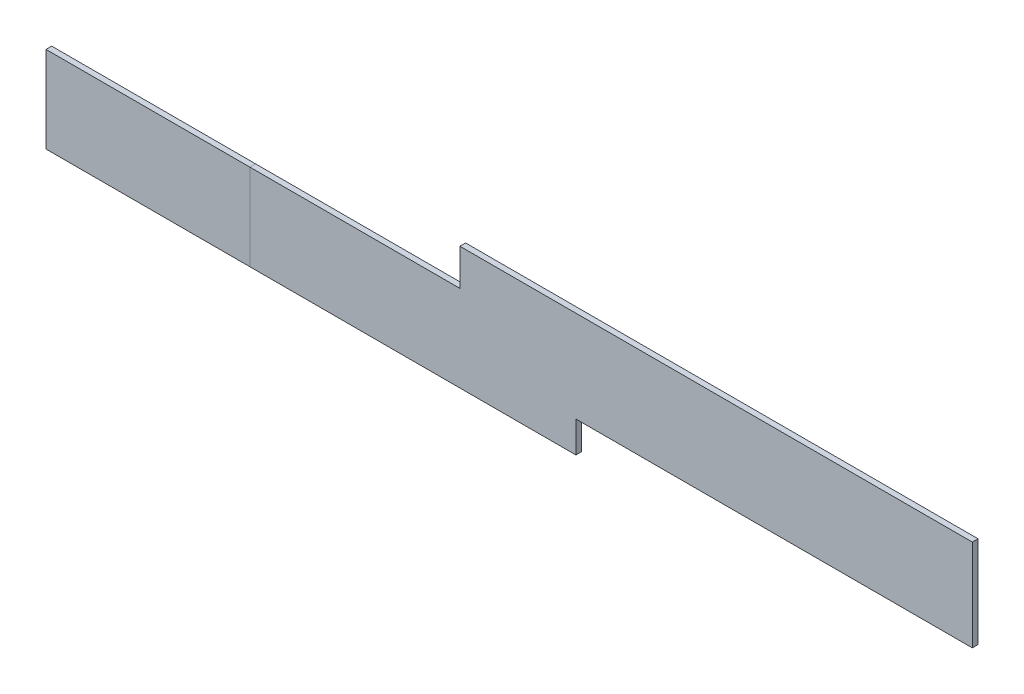
ISO-10303-21;
HEADER;
FILE_DESCRIPTION(('STEP AP214'),'2;1');
FILE_NAME('part.step','',(''),(''),'','','');
FILE_SCHEMA(('AUTOMOTIVE_DESIGN { 1 0 10303 214 1 1 1 1 }'));
ENDSEC;
DATA;
#1=APPLICATION_CONTEXT('core data for automotive mechanical design processes');
#2=APPLICATION_PROTOCOL_DEFINITION('international standard','automotive_design',2000,#1);
#3=PRODUCT_CONTEXT('',#1,'mechanical');
#4=PRODUCT('Part','Part','',(#3));
#5=PRODUCT_RELATED_PRODUCT_CATEGORY('part','',(#4));
#6=PRODUCT_DEFINITION_FORMATION('','',#4);
#7=PRODUCT_DEFINITION_CONTEXT('part definition',#1,'design');
#8=PRODUCT_DEFINITION('design','',#6,#7);
#9=PRODUCT_DEFINITION_SHAPE('','',#8);
#10=(LENGTH_UNIT() NAMED_UNIT(*) SI_UNIT(.MILLI.,.METRE.));
#11=(NAMED_UNIT(*) PLANE_ANGLE_UNIT() SI_UNIT($,.RADIAN.));
#12=(NAMED_UNIT(*) SI_UNIT($,.STERADIAN.) SOLID_ANGLE_UNIT());
#13=UNCERTAINTY_MEASURE_WITH_UNIT(LENGTH_MEASURE(1.E-05),#10,'distance_accuracy_value','');
#14=(GEOMETRIC_REPRESENTATION_CONTEXT(3) GLOBAL_UNCERTAINTY_ASSIGNED_CONTEXT((#13)) GLOBAL_UNIT_ASSIGNED_CONTEXT((#10,
#11,#12)) REPRESENTATION_CONTEXT('',''));
#15=CARTESIAN_POINT('',(0.,0.,0.));
#16=DIRECTION('',(0.,0.,1.));
#17=DIRECTION('',(1.,0.,0.));
#18=AXIS2_PLACEMENT_3D('',#15,#16,#17);
#19=CARTESIAN_POINT('',(0.,48.0314,-126.454734060226));
#20=DIRECTION('',(1.,0.,0.));
#21=DIRECTION('',(0.,1.,0.));
#22=AXIS2_PLACEMENT_3D('',#19,#20,#21);
#23=PLANE('',#22);
#24=DIRECTION('',(0.,-1.,0.));
#25=VECTOR('',#24,1.);
#26=CARTESIAN_POINT('',(0.,48.0314,-3.175));
#27=LINE('',#26,#25);
#28=CARTESIAN_POINT('',(0.,48.0314,-3.175));
#29=VERTEX_POINT('',#28);
#30=CARTESIAN_POINT('',(0.,0.,-3.175));
#31=VERTEX_POINT('',#30);
#32=EDGE_CURVE('E51',#29,#31,#27,.T.);
#33=ORIENTED_EDGE('',*,*,#32,.F.);
#34=DIRECTION('',(0.,0.,1.));
#35=VECTOR('',#34,1.);
#36=CARTESIAN_POINT('',(0.,48.0314,-126.454734060226));
#37=LINE('',#36,#35);
#38=CARTESIAN_POINT('',(0.,48.0314,0.));
#39=VERTEX_POINT('',#38);
#40=EDGE_CURVE('E79',#29,#39,#37,.T.);
#41=ORIENTED_EDGE('',*,*,#40,.T.);
#42=DIRECTION('',(0.,1.,0.));
#43=VECTOR('',#42,1.);
#44=CARTESIAN_POINT('',(0.,48.0314,0.));
#45=LINE('',#44,#43);
#46=CARTESIAN_POINT('',(0.,0.,0.));
#47=VERTEX_POINT('',#46);
#48=EDGE_CURVE('E83',#47,#39,#45,.T.);
#49=ORIENTED_EDGE('',*,*,#48,.F.);
#50=DIRECTION('',(0.,0.,1.));
#51=VECTOR('',#50,1.);
#52=CARTESIAN_POINT('',(0.,0.,-126.454734060226));
#53=LINE('',#52,#51);
#54=EDGE_CURVE('E106',#31,#47,#53,.T.);
#55=ORIENTED_EDGE('',*,*,#54,.F.);
#56=EDGE_LOOP('',(#33,#41,#49,#55));
#57=FACE_BOUND('',#56,.T.);
#58=ADVANCED_FACE('F43',(#57),#23,.T.);
#59=CARTESIAN_POINT('',(0.,0.,-126.454734060226));
#60=DIRECTION('',(0.,-1.,0.));
#61=DIRECTION('',(1.,0.,0.));
#62=AXIS2_PLACEMENT_3D('',#59,#60,#61);
#63=PLANE('',#62);
#64=DIRECTION('',(-1.,0.,0.));
#65=VECTOR('',#64,1.);
#66=CARTESIAN_POINT('',(0.,0.,-3.175));
#67=LINE('',#66,#65);
#68=CARTESIAN_POINT('',(-113.538,0.,-3.175));
#69=VERTEX_POINT('',#68);
#70=EDGE_CURVE('E57',#31,#69,#67,.T.);
#71=ORIENTED_EDGE('',*,*,#70,.F.);
#72=ORIENTED_EDGE('',*,*,#54,.T.);
#73=DIRECTION('',(1.,0.,0.));
#74=VECTOR('',#73,1.);
#75=CARTESIAN_POINT('',(0.,0.,0.));
#76=LINE('',#75,#74);
#77=CARTESIAN_POINT('',(-113.538,0.,0.));
#78=VERTEX_POINT('',#77);
#79=EDGE_CURVE('E88',#78,#47,#76,.T.);
#80=ORIENTED_EDGE('',*,*,#79,.F.);
#81=DIRECTION('',(0.,0.,1.));
#82=VECTOR('',#81,1.);
#83=CARTESIAN_POINT('',(-113.538,0.,-126.454734060226));
#84=LINE('',#83,#82);
#85=EDGE_CURVE('E109',#69,#78,#84,.T.);
#86=ORIENTED_EDGE('',*,*,#85,.F.);
#87=EDGE_LOOP('',(#71,#72,#80,#86));
#88=FACE_BOUND('',#87,.T.);
#89=ADVANCED_FACE('F115',(#88),#63,.T.);
#90=CARTESIAN_POINT('',(-113.538,48.0314,-126.454734060226));
#91=DIRECTION('',(-1.,0.,0.));
#92=DIRECTION('',(0.,0.,1.));
#93=AXIS2_PLACEMENT_3D('',#90,#91,#92);
#94=PLANE('',#93);
#95=DIRECTION('',(0.,1.,0.));
#96=VECTOR('',#95,1.);
#97=CARTESIAN_POINT('',(-113.538,48.0314,-3.175));
#98=LINE('',#97,#96);
#99=CARTESIAN_POINT('',(-113.538,48.0314,-3.175));
#100=VERTEX_POINT('',#99);
#101=EDGE_CURVE('E108',#69,#100,#98,.T.);
#102=ORIENTED_EDGE('',*,*,#101,.F.);
#103=ORIENTED_EDGE('',*,*,#85,.T.);
#104=DIRECTION('',(0.,-1.,0.));
#105=VECTOR('',#104,1.);
#106=CARTESIAN_POINT('',(-113.538,48.0314,0.));
#107=LINE('',#106,#105);
#108=CARTESIAN_POINT('',(-113.538,48.0314,0.));
#109=VERTEX_POINT('',#108);
#110=EDGE_CURVE('E96',#109,#78,#107,.T.);
#111=ORIENTED_EDGE('',*,*,#110,.F.);
#112=DIRECTION('',(0.,0.,1.));
#113=VECTOR('',#112,1.);
#114=CARTESIAN_POINT('',(-113.538,48.0314,-126.454734060226));
#115=LINE('',#114,#113);
#116=EDGE_CURVE('E87',#100,#109,#115,.T.);
#117=ORIENTED_EDGE('',*,*,#116,.F.);
#118=EDGE_LOOP('',(#102,#103,#111,#117));
#119=FACE_BOUND('',#118,.T.);
#120=ADVANCED_FACE('F113',(#119),#94,.T.);
#121=CARTESIAN_POINT('',(0.,48.0314,-126.454734060226));
#122=DIRECTION('',(0.,1.,0.));
#123=DIRECTION('',(0.,0.,1.));
#124=AXIS2_PLACEMENT_3D('',#121,#122,#123);
#125=PLANE('',#124);
#126=DIRECTION('',(1.,0.,0.));
#127=VECTOR('',#126,1.);
#128=CARTESIAN_POINT('',(0.,48.0314,-3.175));
#129=LINE('',#128,#127);
#130=EDGE_CURVE('E12',#100,#29,#129,.T.);
#131=ORIENTED_EDGE('',*,*,#130,.F.);
#132=ORIENTED_EDGE('',*,*,#116,.T.);
#133=DIRECTION('',(-1.,0.,0.));
#134=VECTOR('',#133,1.);
#135=CARTESIAN_POINT('',(0.,48.0314,0.));
#136=LINE('',#135,#134);
#137=EDGE_CURVE('E90',#39,#109,#136,.T.);
#138=ORIENTED_EDGE('',*,*,#137,.F.);
#139=ORIENTED_EDGE('',*,*,#40,.F.);
#140=EDGE_LOOP('',(#131,#132,#138,#139));
#141=FACE_BOUND('',#140,.T.);
#142=ADVANCED_FACE('F91',(#141),#125,.T.);
#143=CARTESIAN_POINT('',(0.,0.,0.));
#144=DIRECTION('',(0.,0.,-1.));
#145=DIRECTION('',(-1.,0.,0.));
#146=AXIS2_PLACEMENT_3D('',#143,#144,#145);
#147=PLANE('',#146);
#148=ORIENTED_EDGE('',*,*,#48,.T.);
#149=ORIENTED_EDGE('',*,*,#137,.T.);
#150=ORIENTED_EDGE('',*,*,#110,.T.);
#151=ORIENTED_EDGE('',*,*,#79,.T.);
#152=EDGE_LOOP('',(#148,#149,#150,#151));
#153=FACE_BOUND('',#152,.T.);
#154=ADVANCED_FACE('F98',(#153),#147,.F.);
#155=CARTESIAN_POINT('',(0.,0.,-3.175));
#156=DIRECTION('',(0.,0.,1.));
#157=DIRECTION('',(1.,0.,0.));
#158=AXIS2_PLACEMENT_3D('',#155,#156,#157);
#159=PLANE('',#158);
#160=ORIENTED_EDGE('',*,*,#32,.T.);
#161=ORIENTED_EDGE('',*,*,#70,.T.);
#162=ORIENTED_EDGE('',*,*,#101,.T.);
#163=ORIENTED_EDGE('',*,*,#130,.T.);
#164=EDGE_LOOP('',(#160,#161,#162,#163));
#165=FACE_BOUND('',#164,.T.);
#166=ADVANCED_FACE('F117',(#165),#159,.F.);
#167=CLOSED_SHELL('',(#58,#89,#120,#142,#154,#166));
#168=MANIFOLD_SOLID_BREP('B2',#167);
#169=CARTESIAN_POINT('',(0.,0.,-3.175));
#170=DIRECTION('',(0.,-1.,0.));
#171=DIRECTION('',(0.,0.,-1.));
#172=AXIS2_PLACEMENT_3D('',#169,#170,#171);
#173=PLANE('',#172);
#174=DIRECTION('',(1.,0.,0.));
#175=VECTOR('',#174,1.);
#176=CARTESIAN_POINT('',(0.,0.,0.));
#177=LINE('',#176,#175);
#178=CARTESIAN_POINT('',(0.,0.,0.));
#179=VERTEX_POINT('',#178);
#180=CARTESIAN_POINT('',(181.39918,0.,0.));
#181=VERTEX_POINT('',#180);
#182=EDGE_CURVE('E273',#179,#181,#177,.T.);
#183=ORIENTED_EDGE('',*,*,#182,.F.);
#184=DIRECTION('',(0.,0.,1.));
#185=VECTOR('',#184,1.);
#186=CARTESIAN_POINT('',(0.,0.,-3.175));
#187=LINE('',#186,#185);
#188=CARTESIAN_POINT('',(0.,0.,-3.175));
#189=VERTEX_POINT('',#188);
#190=EDGE_CURVE('E41',#189,#179,#187,.T.);
#191=ORIENTED_EDGE('',*,*,#190,.F.);
#192=DIRECTION('',(1.,0.,0.));
#193=VECTOR('',#192,1.);
#194=CARTESIAN_POINT('',(0.,0.,-3.175));
#195=LINE('',#194,#193);
#196=CARTESIAN_POINT('',(181.39918,0.,-3.17500000000001));
#197=VERTEX_POINT('',#196);
#198=EDGE_CURVE('E278',#189,#197,#195,.T.);
#199=ORIENTED_EDGE('',*,*,#198,.T.);
#200=DIRECTION('',(0.,0.,1.));
#201=VECTOR('',#200,1.);
#202=CARTESIAN_POINT('',(181.39918,0.,-146.015451823004));
#203=LINE('',#202,#201);
#204=EDGE_CURVE('E249',#197,#181,#203,.T.);
#205=ORIENTED_EDGE('',*,*,#204,.T.);
#206=EDGE_LOOP('',(#183,#191,#199,#205));
#207=FACE_BOUND('',#206,.T.);
#208=ADVANCED_FACE('F167',(#207),#173,.T.);
#209=CARTESIAN_POINT('',(0.,48.0314,-3.175));
#210=DIRECTION('',(-1.,0.,0.));
#211=DIRECTION('',(0.,-1.,0.));
#212=AXIS2_PLACEMENT_3D('',#209,#210,#211);
#213=PLANE('',#212);
#214=DIRECTION('',(0.,-1.,0.));
#215=VECTOR('',#214,1.);
#216=CARTESIAN_POINT('',(0.,48.0314,0.));
#217=LINE('',#216,#215);
#218=CARTESIAN_POINT('',(0.,48.0314,0.));
#219=VERTEX_POINT('',#218);
#220=EDGE_CURVE('E281',#219,#179,#217,.T.);
#221=ORIENTED_EDGE('',*,*,#220,.F.);
#222=DIRECTION('',(0.,0.,1.));
#223=VECTOR('',#222,1.);
#224=CARTESIAN_POINT('',(0.,48.0314,-3.175));
#225=LINE('',#224,#223);
#226=CARTESIAN_POINT('',(0.,48.0314,-3.175));
#227=VERTEX_POINT('',#226);
#228=EDGE_CURVE('E176',#227,#219,#225,.T.);
#229=ORIENTED_EDGE('',*,*,#228,.F.);
#230=DIRECTION('',(0.,-1.,0.));
#231=VECTOR('',#230,1.);
#232=CARTESIAN_POINT('',(0.,48.0314,-3.175));
#233=LINE('',#232,#231);
#234=EDGE_CURVE('E288',#227,#189,#233,.T.);
#235=ORIENTED_EDGE('',*,*,#234,.T.);
#236=ORIENTED_EDGE('',*,*,#190,.T.);
#237=EDGE_LOOP('',(#221,#229,#235,#236));
#238=FACE_BOUND('',#237,.T.);
#239=ADVANCED_FACE('F304',(#238),#213,.T.);
#240=CARTESIAN_POINT('',(0.,48.0314,-3.175));
#241=DIRECTION('',(0.,1.,0.));
#242=DIRECTION('',(0.,0.,1.));
#243=AXIS2_PLACEMENT_3D('',#240,#241,#242);
#244=PLANE('',#243);
#245=DIRECTION('',(-1.,0.,0.));
#246=VECTOR('',#245,1.);
#247=CARTESIAN_POINT('',(0.,48.0314,0.));
#248=LINE('',#247,#246);
#249=CARTESIAN_POINT('',(116.84,48.0314,0.));
#250=VERTEX_POINT('',#249);
#251=EDGE_CURVE('E296',#250,#219,#248,.T.);
#252=ORIENTED_EDGE('',*,*,#251,.F.);
#253=DIRECTION('',(0.,0.,1.));
#254=VECTOR('',#253,1.);
#255=CARTESIAN_POINT('',(116.84,48.0314,-3.175));
#256=LINE('',#255,#254);
#257=CARTESIAN_POINT('',(116.84,48.0314,-3.175));
#258=VERTEX_POINT('',#257);
#259=EDGE_CURVE('E300',#258,#250,#256,.T.);
#260=ORIENTED_EDGE('',*,*,#259,.F.);
#261=DIRECTION('',(-1.,0.,0.));
#262=VECTOR('',#261,1.);
#263=CARTESIAN_POINT('',(0.,48.0314,-3.175));
#264=LINE('',#263,#262);
#265=EDGE_CURVE('E286',#258,#227,#264,.T.);
#266=ORIENTED_EDGE('',*,*,#265,.T.);
#267=ORIENTED_EDGE('',*,*,#228,.T.);
#268=EDGE_LOOP('',(#252,#260,#266,#267));
#269=FACE_BOUND('',#268,.T.);
#270=ADVANCED_FACE('F307',(#269),#244,.T.);
#271=CARTESIAN_POINT('',(116.84,68.3514,-3.175));
#272=DIRECTION('',(-1.,0.,0.));
#273=DIRECTION('',(0.,-1.,0.));
#274=AXIS2_PLACEMENT_3D('',#271,#272,#273);
#275=PLANE('',#274);
#276=DIRECTION('',(0.,-1.,0.));
#277=VECTOR('',#276,1.);
#278=CARTESIAN_POINT('',(116.84,68.3514,0.));
#279=LINE('',#278,#277);
#280=CARTESIAN_POINT('',(116.84,68.3514,0.));
#281=VERTEX_POINT('',#280);
#282=EDGE_CURVE('E293',#281,#250,#279,.T.);
#283=ORIENTED_EDGE('',*,*,#282,.F.);
#284=DIRECTION('',(0.,0.,1.));
#285=VECTOR('',#284,1.);
#286=CARTESIAN_POINT('',(116.84,68.3514,-3.175));
#287=LINE('',#286,#285);
#288=CARTESIAN_POINT('',(116.84,68.3514,-3.175));
#289=VERTEX_POINT('',#288);
#290=EDGE_CURVE('E170',#289,#281,#287,.T.);
#291=ORIENTED_EDGE('',*,*,#290,.F.);
#292=DIRECTION('',(0.,-1.,0.));
#293=VECTOR('',#292,1.);
#294=CARTESIAN_POINT('',(116.84,68.3514,-3.175));
#295=LINE('',#294,#293);
#296=EDGE_CURVE('E284',#289,#258,#295,.T.);
#297=ORIENTED_EDGE('',*,*,#296,.T.);
#298=ORIENTED_EDGE('',*,*,#259,.T.);
#299=EDGE_LOOP('',(#283,#291,#297,#298));
#300=FACE_BOUND('',#299,.T.);
#301=ADVANCED_FACE('F303',(#300),#275,.T.);
#302=CARTESIAN_POINT('',(116.84,68.3514,-3.175));
#303=DIRECTION('',(0.,1.,0.));
#304=DIRECTION('',(0.,0.,1.));
#305=AXIS2_PLACEMENT_3D('',#302,#303,#304);
#306=PLANE('',#305);
#307=DIRECTION('',(-1.,0.,0.));
#308=VECTOR('',#307,1.);
#309=CARTESIAN_POINT('',(116.84,68.3514,0.));
#310=LINE('',#309,#308);
#311=CARTESIAN_POINT('',(402.03374,68.3514,0.));
#312=VERTEX_POINT('',#311);
#313=EDGE_CURVE('E291',#312,#281,#310,.T.);
#314=ORIENTED_EDGE('',*,*,#313,.F.);
#315=DIRECTION('',(0.,0.,1.));
#316=VECTOR('',#315,1.);
#317=CARTESIAN_POINT('',(402.03374,68.3514,-119.457816090124));
#318=LINE('',#317,#316);
#319=CARTESIAN_POINT('',(402.03374,68.3514,-3.175));
#320=VERTEX_POINT('',#319);
#321=EDGE_CURVE('E258',#320,#312,#318,.T.);
#322=ORIENTED_EDGE('',*,*,#321,.F.);
#323=DIRECTION('',(-1.,0.,0.));
#324=VECTOR('',#323,1.);
#325=CARTESIAN_POINT('',(116.84,68.3514,-3.175));
#326=LINE('',#325,#324);
#327=EDGE_CURVE('E280',#320,#289,#326,.T.);
#328=ORIENTED_EDGE('',*,*,#327,.T.);
#329=ORIENTED_EDGE('',*,*,#290,.T.);
#330=EDGE_LOOP('',(#314,#322,#328,#329));
#331=FACE_BOUND('',#330,.T.);
#332=ADVANCED_FACE('F302',(#331),#306,.T.);
#333=CARTESIAN_POINT('',(0.,0.,-3.175));
#334=DIRECTION('',(0.,0.,1.));
#335=DIRECTION('',(1.,0.,0.));
#336=AXIS2_PLACEMENT_3D('',#333,#334,#335);
#337=PLANE('',#336);
#338=ORIENTED_EDGE('',*,*,#198,.F.);
#339=ORIENTED_EDGE('',*,*,#234,.F.);
#340=ORIENTED_EDGE('',*,*,#265,.F.);
#341=ORIENTED_EDGE('',*,*,#296,.F.);
#342=ORIENTED_EDGE('',*,*,#327,.F.);
#343=DIRECTION('',(0.,-1.,0.));
#344=VECTOR('',#343,1.);
#345=CARTESIAN_POINT('',(402.03374,68.3514,-3.175));
#346=LINE('',#345,#344);
#347=CARTESIAN_POINT('',(402.03374,17.33804,-3.175));
#348=VERTEX_POINT('',#347);
#349=EDGE_CURVE('E266',#320,#348,#346,.T.);
#350=ORIENTED_EDGE('',*,*,#349,.T.);
#351=DIRECTION('',(-1.,0.,0.));
#352=VECTOR('',#351,1.);
#353=CARTESIAN_POINT('',(297.53814,17.33804,-3.17500000000001));
#354=LINE('',#353,#352);
#355=CARTESIAN_POINT('',(181.39918,17.33804,-3.17500000000001));
#356=VERTEX_POINT('',#355);
#357=EDGE_CURVE('E254',#348,#356,#354,.T.);
#358=ORIENTED_EDGE('',*,*,#357,.T.);
#359=DIRECTION('',(0.,-1.,0.));
#360=VECTOR('',#359,1.);
#361=CARTESIAN_POINT('',(181.39918,0.,-3.17500000000001));
#362=LINE('',#361,#360);
#363=EDGE_CURVE('E268',#356,#197,#362,.T.);
#364=ORIENTED_EDGE('',*,*,#363,.T.);
#365=EDGE_LOOP('',(#338,#339,#340,#341,#342,#350,#358,#364));
#366=FACE_BOUND('',#365,.T.);
#367=ADVANCED_FACE('F309',(#366),#337,.F.);
#368=CARTESIAN_POINT('',(0.,0.,0.));
#369=DIRECTION('',(0.,0.,1.));
#370=DIRECTION('',(1.,0.,0.));
#371=AXIS2_PLACEMENT_3D('',#368,#369,#370);
#372=PLANE('',#371);
#373=ORIENTED_EDGE('',*,*,#182,.T.);
#374=DIRECTION('',(0.,1.,0.));
#375=VECTOR('',#374,1.);
#376=CARTESIAN_POINT('',(181.39918,0.,0.));
#377=LINE('',#376,#375);
#378=CARTESIAN_POINT('',(181.39918,17.33804,0.));
#379=VERTEX_POINT('',#378);
#380=EDGE_CURVE('E246',#181,#379,#377,.T.);
#381=ORIENTED_EDGE('',*,*,#380,.T.);
#382=DIRECTION('',(1.,0.,0.));
#383=VECTOR('',#382,1.);
#384=CARTESIAN_POINT('',(297.53814,17.33804,0.));
#385=LINE('',#384,#383);
#386=CARTESIAN_POINT('',(402.03374,17.33804,0.));
#387=VERTEX_POINT('',#386);
#388=EDGE_CURVE('E239',#379,#387,#385,.T.);
#389=ORIENTED_EDGE('',*,*,#388,.T.);
#390=DIRECTION('',(0.,1.,0.));
#391=VECTOR('',#390,1.);
#392=CARTESIAN_POINT('',(402.03374,68.3514,0.));
#393=LINE('',#392,#391);
#394=EDGE_CURVE('E244',#387,#312,#393,.T.);
#395=ORIENTED_EDGE('',*,*,#394,.T.);
#396=ORIENTED_EDGE('',*,*,#313,.T.);
#397=ORIENTED_EDGE('',*,*,#282,.T.);
#398=ORIENTED_EDGE('',*,*,#251,.T.);
#399=ORIENTED_EDGE('',*,*,#220,.T.);
#400=EDGE_LOOP('',(#373,#381,#389,#395,#396,#397,#398,#399));
#401=FACE_BOUND('',#400,.T.);
#402=ADVANCED_FACE('F241',(#401),#372,.T.);
#403=CARTESIAN_POINT('',(297.53814,17.33804,-146.015451823004));
#404=DIRECTION('',(0.,-1.,0.));
#405=DIRECTION('',(1.,0.,0.));
#406=AXIS2_PLACEMENT_3D('',#403,#404,#405);
#407=PLANE('',#406);
#408=ORIENTED_EDGE('',*,*,#357,.F.);
#409=DIRECTION('',(0.,0.,1.));
#410=VECTOR('',#409,1.);
#411=CARTESIAN_POINT('',(402.03374,17.33804,-119.457816090124));
#412=LINE('',#411,#410);
#413=EDGE_CURVE('E252',#348,#387,#412,.T.);
#414=ORIENTED_EDGE('',*,*,#413,.T.);
#415=ORIENTED_EDGE('',*,*,#388,.F.);
#416=DIRECTION('',(0.,0.,1.));
#417=VECTOR('',#416,1.);
#418=CARTESIAN_POINT('',(181.39918,17.33804,-146.015451823004));
#419=LINE('',#418,#417);
#420=EDGE_CURVE('E271',#356,#379,#419,.T.);
#421=ORIENTED_EDGE('',*,*,#420,.F.);
#422=EDGE_LOOP('',(#408,#414,#415,#421));
#423=FACE_BOUND('',#422,.T.);
#424=ADVANCED_FACE('F253',(#423),#407,.T.);
#425=CARTESIAN_POINT('',(181.39918,0.,-146.015451823004));
#426=DIRECTION('',(1.,0.,0.));
#427=DIRECTION('',(0.,0.,-1.));
#428=AXIS2_PLACEMENT_3D('',#425,#426,#427);
#429=PLANE('',#428);
#430=ORIENTED_EDGE('',*,*,#363,.F.);
#431=ORIENTED_EDGE('',*,*,#420,.T.);
#432=ORIENTED_EDGE('',*,*,#380,.F.);
#433=ORIENTED_EDGE('',*,*,#204,.F.);
#434=EDGE_LOOP('',(#430,#431,#432,#433));
#435=FACE_BOUND('',#434,.T.);
#436=ADVANCED_FACE('F313',(#435),#429,.T.);
#437=CARTESIAN_POINT('',(402.03374,68.3514,-119.457816090124));
#438=DIRECTION('',(1.,0.,0.));
#439=DIRECTION('',(0.,0.,-1.));
#440=AXIS2_PLACEMENT_3D('',#437,#438,#439);
#441=PLANE('',#440);
#442=ORIENTED_EDGE('',*,*,#349,.F.);
#443=ORIENTED_EDGE('',*,*,#321,.T.);
#444=ORIENTED_EDGE('',*,*,#394,.F.);
#445=ORIENTED_EDGE('',*,*,#413,.F.);
#446=EDGE_LOOP('',(#442,#443,#444,#445));
#447=FACE_BOUND('',#446,.T.);
#448=ADVANCED_FACE('F261',(#447),#441,.T.);
#449=CLOSED_SHELL('',(#208,#239,#270,#301,#332,#367,#402,#424,#436,#448));
#450=MANIFOLD_SOLID_BREP('B6',#449);
#451=ADVANCED_BREP_SHAPE_REPRESENTATION('',(#18,#168,#450),#14);
#452=SHAPE_DEFINITION_REPRESENTATION(#9,#451);
ENDSEC;
END-ISO-10303-21;
